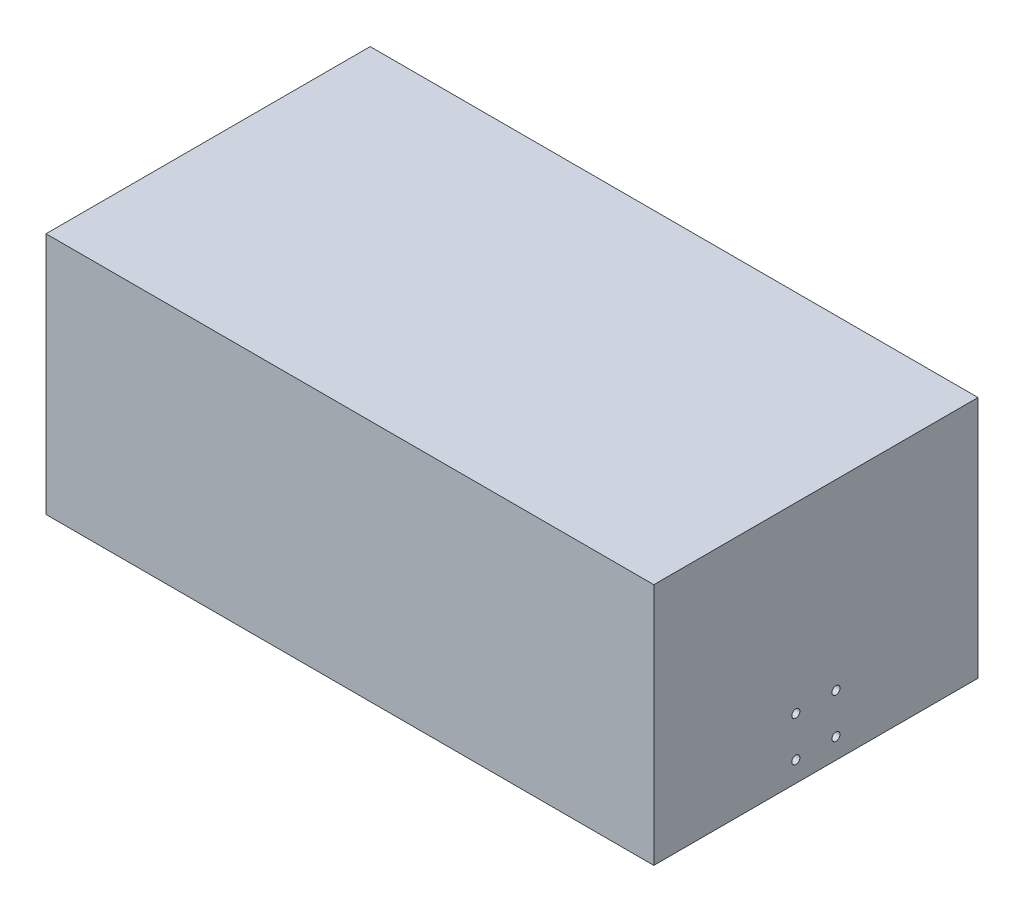
ISO-10303-21;
HEADER;
FILE_DESCRIPTION(('STEP AP214'),'2;1');
FILE_NAME('part.step','',(''),(''),'','','');
FILE_SCHEMA(('AUTOMOTIVE_DESIGN { 1 0 10303 214 1 1 1 1 }'));
ENDSEC;
DATA;
#1=APPLICATION_CONTEXT('core data for automotive mechanical design processes');
#2=APPLICATION_PROTOCOL_DEFINITION('international standard','automotive_design',2000,#1);
#3=PRODUCT_CONTEXT('',#1,'mechanical');
#4=PRODUCT('Part','Part','',(#3));
#5=PRODUCT_RELATED_PRODUCT_CATEGORY('part','',(#4));
#6=PRODUCT_DEFINITION_FORMATION('','',#4);
#7=PRODUCT_DEFINITION_CONTEXT('part definition',#1,'design');
#8=PRODUCT_DEFINITION('design','',#6,#7);
#9=PRODUCT_DEFINITION_SHAPE('','',#8);
#10=(LENGTH_UNIT() NAMED_UNIT(*) SI_UNIT(.MILLI.,.METRE.));
#11=(NAMED_UNIT(*) PLANE_ANGLE_UNIT() SI_UNIT($,.RADIAN.));
#12=(NAMED_UNIT(*) SI_UNIT($,.STERADIAN.) SOLID_ANGLE_UNIT());
#13=UNCERTAINTY_MEASURE_WITH_UNIT(LENGTH_MEASURE(1.E-05),#10,'distance_accuracy_value','');
#14=(GEOMETRIC_REPRESENTATION_CONTEXT(3) GLOBAL_UNCERTAINTY_ASSIGNED_CONTEXT((#13)) GLOBAL_UNIT_ASSIGNED_CONTEXT((#10,
#11,#12)) REPRESENTATION_CONTEXT('',''));
#15=CARTESIAN_POINT('',(0.,0.,0.));
#16=DIRECTION('',(0.,0.,1.));
#17=DIRECTION('',(1.,0.,0.));
#18=AXIS2_PLACEMENT_3D('',#15,#16,#17);
#19=CARTESIAN_POINT('',(0.,60.,0.));
#20=DIRECTION('',(1.,0.,0.));
#21=DIRECTION('',(0.,0.,-1.));
#22=AXIS2_PLACEMENT_3D('',#19,#20,#21);
#23=PLANE('',#22);
#24=DIRECTION('',(0.,0.,1.));
#25=VECTOR('',#24,1.);
#26=CARTESIAN_POINT('',(0.,0.,0.));
#27=LINE('',#26,#25);
#28=CARTESIAN_POINT('',(0.,0.,-80.));
#29=VERTEX_POINT('',#28);
#30=CARTESIAN_POINT('',(0.,0.,0.));
#31=VERTEX_POINT('',#30);
#32=EDGE_CURVE('E98',#29,#31,#27,.T.);
#33=ORIENTED_EDGE('',*,*,#32,.T.);
#34=DIRECTION('',(0.,-1.,0.));
#35=VECTOR('',#34,1.);
#36=CARTESIAN_POINT('',(0.,60.,0.));
#37=LINE('',#36,#35);
#38=CARTESIAN_POINT('',(0.,60.,0.));
#39=VERTEX_POINT('',#38);
#40=EDGE_CURVE('E11',#39,#31,#37,.T.);
#41=ORIENTED_EDGE('',*,*,#40,.F.);
#42=DIRECTION('',(0.,0.,1.));
#43=VECTOR('',#42,1.);
#44=CARTESIAN_POINT('',(0.,60.,0.));
#45=LINE('',#44,#43);
#46=CARTESIAN_POINT('',(0.,60.,-80.));
#47=VERTEX_POINT('',#46);
#48=EDGE_CURVE('E86',#47,#39,#45,.T.);
#49=ORIENTED_EDGE('',*,*,#48,.F.);
#50=DIRECTION('',(0.,-1.,0.));
#51=VECTOR('',#50,1.);
#52=CARTESIAN_POINT('',(0.,60.,-80.));
#53=LINE('',#52,#51);
#54=EDGE_CURVE('E94',#47,#29,#53,.T.);
#55=ORIENTED_EDGE('',*,*,#54,.T.);
#56=EDGE_LOOP('',(#33,#41,#49,#55));
#57=FACE_BOUND('',#56,.T.);
#58=ADVANCED_FACE('F35',(#57),#23,.F.);
#59=CARTESIAN_POINT('',(0.,60.,0.));
#60=DIRECTION('',(0.,0.,-1.));
#61=DIRECTION('',(-1.,0.,0.));
#62=AXIS2_PLACEMENT_3D('',#59,#60,#61);
#63=PLANE('',#62);
#64=DIRECTION('',(1.,0.,0.));
#65=VECTOR('',#64,1.);
#66=CARTESIAN_POINT('',(0.,0.,0.));
#67=LINE('',#66,#65);
#68=CARTESIAN_POINT('',(150.,0.,0.));
#69=VERTEX_POINT('',#68);
#70=EDGE_CURVE('E90',#31,#69,#67,.T.);
#71=ORIENTED_EDGE('',*,*,#70,.T.);
#72=DIRECTION('',(0.,-1.,0.));
#73=VECTOR('',#72,1.);
#74=CARTESIAN_POINT('',(150.,60.,0.));
#75=LINE('',#74,#73);
#76=CARTESIAN_POINT('',(150.,60.,0.));
#77=VERTEX_POINT('',#76);
#78=EDGE_CURVE('E43',#77,#69,#75,.T.);
#79=ORIENTED_EDGE('',*,*,#78,.F.);
#80=DIRECTION('',(1.,0.,0.));
#81=VECTOR('',#80,1.);
#82=CARTESIAN_POINT('',(0.,60.,0.));
#83=LINE('',#82,#81);
#84=EDGE_CURVE('E81',#39,#77,#83,.T.);
#85=ORIENTED_EDGE('',*,*,#84,.F.);
#86=ORIENTED_EDGE('',*,*,#40,.T.);
#87=EDGE_LOOP('',(#71,#79,#85,#86));
#88=FACE_BOUND('',#87,.T.);
#89=ADVANCED_FACE('F89',(#88),#63,.F.);
#90=CARTESIAN_POINT('',(150.,60.,0.));
#91=DIRECTION('',(-1.,0.,0.));
#92=DIRECTION('',(0.,0.,1.));
#93=AXIS2_PLACEMENT_3D('',#90,#91,#92);
#94=PLANE('',#93);
#95=CARTESIAN_POINT('',(150.,14.9497474683058,-44.9497474683058));
#96=DIRECTION('',(1.,0.,0.));
#97=DIRECTION('',(0.,0.,-1.));
#98=AXIS2_PLACEMENT_3D('',#95,#96,#97);
#99=CIRCLE('',#98,0.999999999999998);
#100=CARTESIAN_POINT('',(150.,14.9497474683058,-45.9497474683058));
#101=VERTEX_POINT('',#100);
#102=EDGE_CURVE('E130',#101,#101,#99,.T.);
#103=ORIENTED_EDGE('',*,*,#102,.F.);
#104=EDGE_LOOP('',(#103));
#105=FACE_BOUND('',#104,.T.);
#106=CARTESIAN_POINT('',(150.,5.05025253169417,-44.9497474683058));
#107=DIRECTION('',(1.,0.,0.));
#108=DIRECTION('',(0.,0.,-1.));
#109=AXIS2_PLACEMENT_3D('',#106,#107,#108);
#110=CIRCLE('',#109,0.999999999999991);
#111=CARTESIAN_POINT('',(150.,5.05025253169417,-45.9497474683058));
#112=VERTEX_POINT('',#111);
#113=EDGE_CURVE('E124',#112,#112,#110,.T.);
#114=ORIENTED_EDGE('',*,*,#113,.F.);
#115=EDGE_LOOP('',(#114));
#116=FACE_BOUND('',#115,.T.);
#117=CARTESIAN_POINT('',(150.,5.05025253169416,-35.0502525316942));
#118=DIRECTION('',(1.,0.,0.));
#119=DIRECTION('',(0.,0.,-1.));
#120=AXIS2_PLACEMENT_3D('',#117,#118,#119);
#121=CIRCLE('',#120,0.999999999999998);
#122=CARTESIAN_POINT('',(150.,5.05025253169416,-36.0502525316942));
#123=VERTEX_POINT('',#122);
#124=EDGE_CURVE('E118',#123,#123,#121,.T.);
#125=ORIENTED_EDGE('',*,*,#124,.F.);
#126=EDGE_LOOP('',(#125));
#127=FACE_BOUND('',#126,.T.);
#128=CARTESIAN_POINT('',(150.,14.9497474683058,-35.0502525316942));
#129=DIRECTION('',(1.,0.,0.));
#130=DIRECTION('',(0.,0.,-1.));
#131=AXIS2_PLACEMENT_3D('',#128,#129,#130);
#132=CIRCLE('',#131,0.999999999999998);
#133=CARTESIAN_POINT('',(150.,14.9497474683058,-36.0502525316942));
#134=VERTEX_POINT('',#133);
#135=EDGE_CURVE('E112',#134,#134,#132,.T.);
#136=ORIENTED_EDGE('',*,*,#135,.F.);
#137=EDGE_LOOP('',(#136));
#138=FACE_BOUND('',#137,.T.);
#139=DIRECTION('',(0.,0.,-1.));
#140=VECTOR('',#139,1.);
#141=CARTESIAN_POINT('',(150.,0.,0.));
#142=LINE('',#141,#140);
#143=CARTESIAN_POINT('',(150.,0.,-80.));
#144=VERTEX_POINT('',#143);
#145=EDGE_CURVE('E68',#69,#144,#142,.T.);
#146=ORIENTED_EDGE('',*,*,#145,.T.);
#147=DIRECTION('',(0.,-1.,0.));
#148=VECTOR('',#147,1.);
#149=CARTESIAN_POINT('',(150.,60.,-80.));
#150=LINE('',#149,#148);
#151=CARTESIAN_POINT('',(150.,60.,-80.));
#152=VERTEX_POINT('',#151);
#153=EDGE_CURVE('E91',#152,#144,#150,.T.);
#154=ORIENTED_EDGE('',*,*,#153,.F.);
#155=DIRECTION('',(0.,0.,-1.));
#156=VECTOR('',#155,1.);
#157=CARTESIAN_POINT('',(150.,60.,0.));
#158=LINE('',#157,#156);
#159=EDGE_CURVE('E84',#77,#152,#158,.T.);
#160=ORIENTED_EDGE('',*,*,#159,.F.);
#161=ORIENTED_EDGE('',*,*,#78,.T.);
#162=EDGE_LOOP('',(#146,#154,#160,#161));
#163=FACE_BOUND('',#162,.T.);
#164=ADVANCED_FACE('F92',(#105,#116,#127,#138,#163),#94,.F.);
#165=CARTESIAN_POINT('',(0.,60.,-80.));
#166=DIRECTION('',(0.,0.,1.));
#167=DIRECTION('',(1.,0.,0.));
#168=AXIS2_PLACEMENT_3D('',#165,#166,#167);
#169=PLANE('',#168);
#170=DIRECTION('',(-1.,0.,0.));
#171=VECTOR('',#170,1.);
#172=CARTESIAN_POINT('',(0.,0.,-80.));
#173=LINE('',#172,#171);
#174=EDGE_CURVE('E74',#144,#29,#173,.T.);
#175=ORIENTED_EDGE('',*,*,#174,.T.);
#176=ORIENTED_EDGE('',*,*,#54,.F.);
#177=DIRECTION('',(-1.,0.,0.));
#178=VECTOR('',#177,1.);
#179=CARTESIAN_POINT('',(0.,60.,-80.));
#180=LINE('',#179,#178);
#181=EDGE_CURVE('E51',#152,#47,#180,.T.);
#182=ORIENTED_EDGE('',*,*,#181,.F.);
#183=ORIENTED_EDGE('',*,*,#153,.T.);
#184=EDGE_LOOP('',(#175,#176,#182,#183));
#185=FACE_BOUND('',#184,.T.);
#186=ADVANCED_FACE('F106',(#185),#169,.F.);
#187=CARTESIAN_POINT('',(0.,60.,0.));
#188=DIRECTION('',(0.,-1.,0.));
#189=DIRECTION('',(0.,0.,-1.));
#190=AXIS2_PLACEMENT_3D('',#187,#188,#189);
#191=PLANE('',#190);
#192=ORIENTED_EDGE('',*,*,#48,.T.);
#193=ORIENTED_EDGE('',*,*,#84,.T.);
#194=ORIENTED_EDGE('',*,*,#159,.T.);
#195=ORIENTED_EDGE('',*,*,#181,.T.);
#196=EDGE_LOOP('',(#192,#193,#194,#195));
#197=FACE_BOUND('',#196,.T.);
#198=ADVANCED_FACE('F82',(#197),#191,.F.);
#199=CARTESIAN_POINT('',(0.,0.,0.));
#200=DIRECTION('',(0.,-1.,0.));
#201=DIRECTION('',(0.,0.,-1.));
#202=AXIS2_PLACEMENT_3D('',#199,#200,#201);
#203=PLANE('',#202);
#204=ORIENTED_EDGE('',*,*,#32,.F.);
#205=ORIENTED_EDGE('',*,*,#174,.F.);
#206=ORIENTED_EDGE('',*,*,#145,.F.);
#207=ORIENTED_EDGE('',*,*,#70,.F.);
#208=EDGE_LOOP('',(#204,#205,#206,#207));
#209=FACE_BOUND('',#208,.T.);
#210=ADVANCED_FACE('F109',(#209),#203,.T.);
#211=CARTESIAN_POINT('',(140.,14.9497474683058,-35.0502525316942));
#212=DIRECTION('',(1.,0.,0.));
#213=DIRECTION('',(0.,0.,-1.));
#214=AXIS2_PLACEMENT_3D('',#211,#212,#213);
#215=CYLINDRICAL_SURFACE('',#214,0.999999999999998);
#216=CARTESIAN_POINT('',(140.,14.9497474683058,-35.0502525316942));
#217=DIRECTION('',(1.,0.,0.));
#218=DIRECTION('',(0.,0.,-1.));
#219=AXIS2_PLACEMENT_3D('',#216,#217,#218);
#220=CIRCLE('',#219,0.999999999999998);
#221=CARTESIAN_POINT('',(140.,14.9497474683058,-36.0502525316942));
#222=VERTEX_POINT('',#221);
#223=EDGE_CURVE('E101',#222,#222,#220,.T.);
#224=ORIENTED_EDGE('',*,*,#223,.F.);
#225=EDGE_LOOP('',(#224));
#226=FACE_BOUND('',#225,.T.);
#227=ORIENTED_EDGE('',*,*,#135,.T.);
#228=EDGE_LOOP('',(#227));
#229=FACE_BOUND('',#228,.T.);
#230=ADVANCED_FACE('F154',(#226,#229),#215,.F.);
#231=CARTESIAN_POINT('',(140.,14.9497474683058,-35.0502525316942));
#232=DIRECTION('',(1.,0.,0.));
#233=DIRECTION('',(0.,0.,-1.));
#234=AXIS2_PLACEMENT_3D('',#231,#232,#233);
#235=PLANE('',#234);
#236=ORIENTED_EDGE('',*,*,#223,.T.);
#237=EDGE_LOOP('',(#236));
#238=FACE_BOUND('',#237,.T.);
#239=ADVANCED_FACE('F156',(#238),#235,.T.);
#240=CARTESIAN_POINT('',(140.,5.05025253169416,-35.0502525316942));
#241=DIRECTION('',(1.,0.,0.));
#242=DIRECTION('',(0.,0.,-1.));
#243=AXIS2_PLACEMENT_3D('',#240,#241,#242);
#244=CYLINDRICAL_SURFACE('',#243,0.999999999999998);
#245=CARTESIAN_POINT('',(140.,5.05025253169416,-35.0502525316942));
#246=DIRECTION('',(1.,0.,0.));
#247=DIRECTION('',(0.,0.,-1.));
#248=AXIS2_PLACEMENT_3D('',#245,#246,#247);
#249=CIRCLE('',#248,0.999999999999998);
#250=CARTESIAN_POINT('',(140.,5.05025253169416,-36.0502525316942));
#251=VERTEX_POINT('',#250);
#252=EDGE_CURVE('E121',#251,#251,#249,.T.);
#253=ORIENTED_EDGE('',*,*,#252,.F.);
#254=EDGE_LOOP('',(#253));
#255=FACE_BOUND('',#254,.T.);
#256=ORIENTED_EDGE('',*,*,#124,.T.);
#257=EDGE_LOOP('',(#256));
#258=FACE_BOUND('',#257,.T.);
#259=ADVANCED_FACE('F163',(#255,#258),#244,.F.);
#260=CARTESIAN_POINT('',(140.,5.05025253169416,-35.0502525316942));
#261=DIRECTION('',(1.,0.,0.));
#262=DIRECTION('',(0.,0.,-1.));
#263=AXIS2_PLACEMENT_3D('',#260,#261,#262);
#264=PLANE('',#263);
#265=ORIENTED_EDGE('',*,*,#252,.T.);
#266=EDGE_LOOP('',(#265));
#267=FACE_BOUND('',#266,.T.);
#268=ADVANCED_FACE('F213',(#267),#264,.T.);
#269=CARTESIAN_POINT('',(140.,5.05025253169417,-44.9497474683058));
#270=DIRECTION('',(1.,0.,0.));
#271=DIRECTION('',(0.,0.,-1.));
#272=AXIS2_PLACEMENT_3D('',#269,#270,#271);
#273=CYLINDRICAL_SURFACE('',#272,0.999999999999991);
#274=CARTESIAN_POINT('',(140.,5.05025253169417,-44.9497474683058));
#275=DIRECTION('',(1.,0.,0.));
#276=DIRECTION('',(0.,0.,-1.));
#277=AXIS2_PLACEMENT_3D('',#274,#275,#276);
#278=CIRCLE('',#277,0.999999999999991);
#279=CARTESIAN_POINT('',(140.,5.05025253169417,-45.9497474683058));
#280=VERTEX_POINT('',#279);
#281=EDGE_CURVE('E127',#280,#280,#278,.T.);
#282=ORIENTED_EDGE('',*,*,#281,.F.);
#283=EDGE_LOOP('',(#282));
#284=FACE_BOUND('',#283,.T.);
#285=ORIENTED_EDGE('',*,*,#113,.T.);
#286=EDGE_LOOP('',(#285));
#287=FACE_BOUND('',#286,.T.);
#288=ADVANCED_FACE('F223',(#284,#287),#273,.F.);
#289=CARTESIAN_POINT('',(140.,5.05025253169417,-44.9497474683058));
#290=DIRECTION('',(1.,0.,0.));
#291=DIRECTION('',(0.,0.,-1.));
#292=AXIS2_PLACEMENT_3D('',#289,#290,#291);
#293=PLANE('',#292);
#294=ORIENTED_EDGE('',*,*,#281,.T.);
#295=EDGE_LOOP('',(#294));
#296=FACE_BOUND('',#295,.T.);
#297=ADVANCED_FACE('F141',(#296),#293,.T.);
#298=CARTESIAN_POINT('',(140.,14.9497474683058,-44.9497474683058));
#299=DIRECTION('',(1.,0.,0.));
#300=DIRECTION('',(0.,0.,-1.));
#301=AXIS2_PLACEMENT_3D('',#298,#299,#300);
#302=CYLINDRICAL_SURFACE('',#301,0.999999999999998);
#303=CARTESIAN_POINT('',(140.,14.9497474683058,-44.9497474683058));
#304=DIRECTION('',(1.,0.,0.));
#305=DIRECTION('',(0.,0.,-1.));
#306=AXIS2_PLACEMENT_3D('',#303,#304,#305);
#307=CIRCLE('',#306,0.999999999999998);
#308=CARTESIAN_POINT('',(140.,14.9497474683058,-45.9497474683058));
#309=VERTEX_POINT('',#308);
#310=EDGE_CURVE('E115',#309,#309,#307,.T.);
#311=ORIENTED_EDGE('',*,*,#310,.F.);
#312=EDGE_LOOP('',(#311));
#313=FACE_BOUND('',#312,.T.);
#314=ORIENTED_EDGE('',*,*,#102,.T.);
#315=EDGE_LOOP('',(#314));
#316=FACE_BOUND('',#315,.T.);
#317=ADVANCED_FACE('F138',(#313,#316),#302,.F.);
#318=CARTESIAN_POINT('',(140.,14.9497474683058,-44.9497474683058));
#319=DIRECTION('',(1.,0.,0.));
#320=DIRECTION('',(0.,0.,-1.));
#321=AXIS2_PLACEMENT_3D('',#318,#319,#320);
#322=PLANE('',#321);
#323=ORIENTED_EDGE('',*,*,#310,.T.);
#324=EDGE_LOOP('',(#323));
#325=FACE_BOUND('',#324,.T.);
#326=ADVANCED_FACE('F136',(#325),#322,.T.);
#327=CLOSED_SHELL('',(#58,#89,#164,#186,#198,#210,#230,#239,#259,#268,#288,#297,#317,#326));
#328=MANIFOLD_SOLID_BREP('B2',#327);
#329=ADVANCED_BREP_SHAPE_REPRESENTATION('',(#18,#328),#14);
#330=SHAPE_DEFINITION_REPRESENTATION(#9,#329);
ENDSEC;
END-ISO-10303-21;
